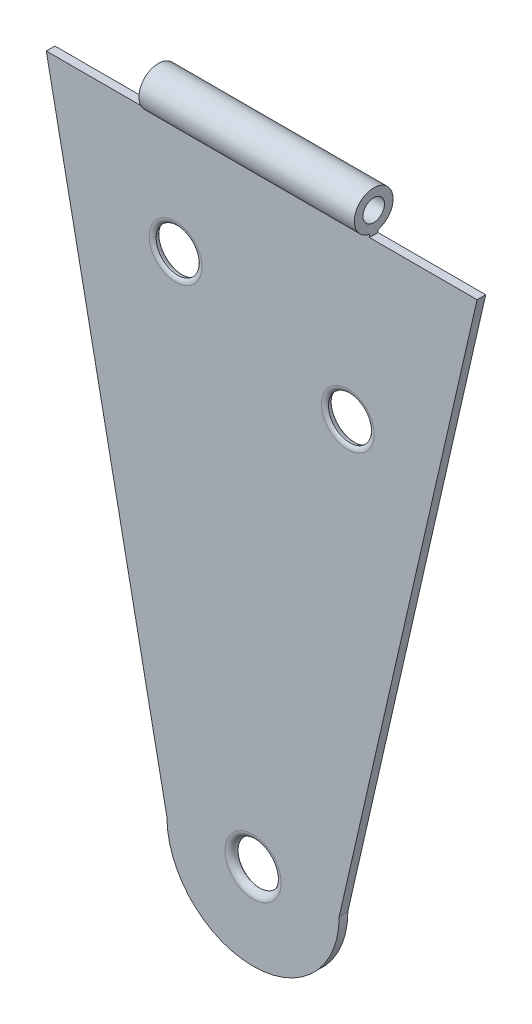
ISO-10303-21;
HEADER;
FILE_DESCRIPTION(('STEP AP214'),'2;1');
FILE_NAME('part.step','',(''),(''),'','','');
FILE_SCHEMA(('AUTOMOTIVE_DESIGN { 1 0 10303 214 1 1 1 1 }'));
ENDSEC;
DATA;
#1=APPLICATION_CONTEXT('core data for automotive mechanical design processes');
#2=APPLICATION_PROTOCOL_DEFINITION('international standard','automotive_design',2000,#1);
#3=PRODUCT_CONTEXT('',#1,'mechanical');
#4=PRODUCT('Part','Part','',(#3));
#5=PRODUCT_RELATED_PRODUCT_CATEGORY('part','',(#4));
#6=PRODUCT_DEFINITION_FORMATION('','',#4);
#7=PRODUCT_DEFINITION_CONTEXT('part definition',#1,'design');
#8=PRODUCT_DEFINITION('design','',#6,#7);
#9=PRODUCT_DEFINITION_SHAPE('','',#8);
#10=(LENGTH_UNIT() NAMED_UNIT(*) SI_UNIT(.MILLI.,.METRE.));
#11=(NAMED_UNIT(*) PLANE_ANGLE_UNIT() SI_UNIT($,.RADIAN.));
#12=(NAMED_UNIT(*) SI_UNIT($,.STERADIAN.) SOLID_ANGLE_UNIT());
#13=UNCERTAINTY_MEASURE_WITH_UNIT(LENGTH_MEASURE(1.E-05),#10,'distance_accuracy_value','');
#14=(GEOMETRIC_REPRESENTATION_CONTEXT(3) GLOBAL_UNCERTAINTY_ASSIGNED_CONTEXT((#13)) GLOBAL_UNIT_ASSIGNED_CONTEXT((#10,
#11,#12)) REPRESENTATION_CONTEXT('',''));
#15=CARTESIAN_POINT('',(0.,0.,0.));
#16=DIRECTION('',(0.,0.,1.));
#17=DIRECTION('',(1.,0.,0.));
#18=AXIS2_PLACEMENT_3D('',#15,#16,#17);
#19=CARTESIAN_POINT('',(0.,0.,0.2));
#20=DIRECTION('',(0.,0.,1.));
#21=DIRECTION('',(1.,0.,0.));
#22=AXIS2_PLACEMENT_3D('',#19,#20,#21);
#23=PLANE('',#22);
#24=CARTESIAN_POINT('',(-12.8478076350027,4.28327146141783,0.2));
#25=DIRECTION('',(0.,0.,1.));
#26=DIRECTION('',(1.,0.,0.));
#27=AXIS2_PLACEMENT_3D('',#24,#25,#26);
#28=CIRCLE('',#27,0.61180339887499);
#29=CARTESIAN_POINT('',(-12.2360042361277,4.28327146141783,0.2));
#30=VERTEX_POINT('',#29);
#31=EDGE_CURVE('E125',#30,#30,#28,.F.);
#32=ORIENTED_EDGE('',*,*,#31,.T.);
#33=EDGE_LOOP('',(#32));
#34=FACE_BOUND('',#33,.T.);
#35=CARTESIAN_POINT('',(-16.8478076350027,5.65262828523672,0.2));
#36=DIRECTION('',(0.,0.,1.));
#37=DIRECTION('',(1.,0.,0.));
#38=AXIS2_PLACEMENT_3D('',#35,#36,#37);
#39=CIRCLE('',#38,0.611803398874989);
#40=CARTESIAN_POINT('',(-16.2360042361277,5.65262828523672,0.2));
#41=VERTEX_POINT('',#40);
#42=EDGE_CURVE('E128',#41,#41,#39,.F.);
#43=ORIENTED_EDGE('',*,*,#42,.T.);
#44=EDGE_LOOP('',(#43));
#45=FACE_BOUND('',#44,.T.);
#46=CARTESIAN_POINT('',(-15.0478076350027,-5.8135010167839,0.2));
#47=DIRECTION('',(0.,0.,1.));
#48=DIRECTION('',(1.,0.,0.));
#49=AXIS2_PLACEMENT_3D('',#46,#47,#48);
#50=CIRCLE('',#49,0.650000000000001);
#51=CARTESIAN_POINT('',(-14.3978076350027,-5.8135010167839,0.2));
#52=VERTEX_POINT('',#51);
#53=EDGE_CURVE('E146',#52,#52,#50,.F.);
#54=ORIENTED_EDGE('',*,*,#53,.T.);
#55=EDGE_LOOP('',(#54));
#56=FACE_BOUND('',#55,.T.);
#57=DIRECTION('',(0.222824801502141,0.974858506571867,0.));
#58=VECTOR('',#57,1.);
#59=CARTESIAN_POINT('',(-11.1371482297741,2.54563388109122,0.2));
#60=LINE('',#59,#58);
#61=CARTESIAN_POINT('',(-13.0478076350027,-5.8135010167839,0.2));
#62=VERTEX_POINT('',#61);
#63=CARTESIAN_POINT('',(-9.8478076350027,8.1864989832161,0.200000000000001));
#64=VERTEX_POINT('',#63);
#65=EDGE_CURVE('E162',#62,#64,#60,.T.);
#66=ORIENTED_EDGE('',*,*,#65,.T.);
#67=DIRECTION('',(-1.,0.,0.));
#68=VECTOR('',#67,1.);
#69=CARTESIAN_POINT('',(0.,8.1864989832161,0.2));
#70=LINE('',#69,#68);
#71=CARTESIAN_POINT('',(-12.3478076350027,8.1864989832161,0.200000000000001));
#72=VERTEX_POINT('',#71);
#73=EDGE_CURVE('E179',#64,#72,#70,.T.);
#74=ORIENTED_EDGE('',*,*,#73,.T.);
#75=DIRECTION('',(0.,1.,0.));
#76=VECTOR('',#75,1.);
#77=CARTESIAN_POINT('',(-12.3478076350027,0.,0.2));
#78=LINE('',#77,#76);
#79=CARTESIAN_POINT('',(-12.3478076350027,8.24775076384649,0.2));
#80=VERTEX_POINT('',#79);
#81=EDGE_CURVE('E188',#72,#80,#78,.T.);
#82=ORIENTED_EDGE('',*,*,#81,.T.);
#83=DIRECTION('',(1.,0.,0.));
#84=VECTOR('',#83,1.);
#85=CARTESIAN_POINT('',(-19.8478076350027,8.24775076384649,0.2));
#86=LINE('',#85,#84);
#87=CARTESIAN_POINT('',(-17.3478076350027,8.24775076384649,0.2));
#88=VERTEX_POINT('',#87);
#89=EDGE_CURVE('E170',#88,#80,#86,.T.);
#90=ORIENTED_EDGE('',*,*,#89,.F.);
#91=DIRECTION('',(0.,-1.,0.));
#92=VECTOR('',#91,1.);
#93=CARTESIAN_POINT('',(-17.3478076350027,0.,0.2));
#94=LINE('',#93,#92);
#95=CARTESIAN_POINT('',(-17.3478076350027,8.1864989832161,0.200000000000001));
#96=VERTEX_POINT('',#95);
#97=EDGE_CURVE('E49',#88,#96,#94,.T.);
#98=ORIENTED_EDGE('',*,*,#97,.T.);
#99=DIRECTION('',(-1.,0.,0.));
#100=VECTOR('',#99,1.);
#101=CARTESIAN_POINT('',(0.,8.1864989832161,0.2));
#102=LINE('',#101,#100);
#103=CARTESIAN_POINT('',(-19.8478076350027,8.1864989832161,0.200000000000001));
#104=VERTEX_POINT('',#103);
#105=EDGE_CURVE('E114',#96,#104,#102,.T.);
#106=ORIENTED_EDGE('',*,*,#105,.T.);
#107=DIRECTION('',(0.196116135138184,-0.98058067569092,0.));
#108=VECTOR('',#107,1.);
#109=CARTESIAN_POINT('',(-17.5101036907303,-3.50202073814605,0.2));
#110=LINE('',#109,#108);
#111=CARTESIAN_POINT('',(-17.0478076350027,-5.8135010167839,0.2));
#112=VERTEX_POINT('',#111);
#113=EDGE_CURVE('E166',#104,#112,#110,.T.);
#114=ORIENTED_EDGE('',*,*,#113,.T.);
#115=CARTESIAN_POINT('',(-15.0478076350027,-5.8135010167839,0.2));
#116=DIRECTION('',(0.,0.,1.));
#117=DIRECTION('',(1.,0.,0.));
#118=AXIS2_PLACEMENT_3D('',#115,#116,#117);
#119=CIRCLE('',#118,2.);
#120=EDGE_CURVE('E173',#112,#62,#119,.T.);
#121=ORIENTED_EDGE('',*,*,#120,.T.);
#122=EDGE_LOOP('',(#66,#74,#82,#90,#98,#106,#114,#121));
#123=FACE_BOUND('',#122,.T.);
#124=ADVANCED_FACE('F34',(#34,#45,#56,#123),#23,.T.);
#125=CARTESIAN_POINT('',(0.,0.,0.));
#126=DIRECTION('',(0.,0.,1.));
#127=DIRECTION('',(1.,0.,0.));
#128=AXIS2_PLACEMENT_3D('',#125,#126,#127);
#129=PLANE('',#128);
#130=CARTESIAN_POINT('',(-15.0478076350027,-5.8135010167839,0.));
#131=DIRECTION('',(0.,0.,1.));
#132=DIRECTION('',(1.,0.,0.));
#133=AXIS2_PLACEMENT_3D('',#130,#131,#132);
#134=CIRCLE('',#133,0.61180339887499);
#135=CARTESIAN_POINT('',(-14.4360042361277,-5.8135010167839,0.));
#136=VERTEX_POINT('',#135);
#137=EDGE_CURVE('E131',#136,#136,#134,.T.);
#138=ORIENTED_EDGE('',*,*,#137,.T.);
#139=EDGE_LOOP('',(#138));
#140=FACE_BOUND('',#139,.T.);
#141=CARTESIAN_POINT('',(-16.8478076350027,5.65262828523672,0.));
#142=DIRECTION('',(0.,0.,1.));
#143=DIRECTION('',(1.,0.,0.));
#144=AXIS2_PLACEMENT_3D('',#141,#142,#143);
#145=CIRCLE('',#144,0.649999999999999);
#146=CARTESIAN_POINT('',(-16.1978076350027,5.65262828523672,0.));
#147=VERTEX_POINT('',#146);
#148=EDGE_CURVE('E140',#147,#147,#145,.T.);
#149=ORIENTED_EDGE('',*,*,#148,.T.);
#150=EDGE_LOOP('',(#149));
#151=FACE_BOUND('',#150,.T.);
#152=CARTESIAN_POINT('',(-12.8478076350027,4.28327146141783,0.));
#153=DIRECTION('',(0.,0.,1.));
#154=DIRECTION('',(1.,0.,0.));
#155=AXIS2_PLACEMENT_3D('',#152,#153,#154);
#156=CIRCLE('',#155,0.650000000000001);
#157=CARTESIAN_POINT('',(-12.1978076350027,4.28327146141783,0.));
#158=VERTEX_POINT('',#157);
#159=EDGE_CURVE('E143',#158,#158,#156,.T.);
#160=ORIENTED_EDGE('',*,*,#159,.T.);
#161=EDGE_LOOP('',(#160));
#162=FACE_BOUND('',#161,.T.);
#163=DIRECTION('',(-1.,0.,0.));
#164=VECTOR('',#163,1.);
#165=CARTESIAN_POINT('',(0.,8.1864989832161,0.));
#166=LINE('',#165,#164);
#167=CARTESIAN_POINT('',(-9.8478076350027,8.1864989832161,0.));
#168=VERTEX_POINT('',#167);
#169=CARTESIAN_POINT('',(-12.3478076350027,8.1864989832161,0.));
#170=VERTEX_POINT('',#169);
#171=EDGE_CURVE('E11',#168,#170,#166,.T.);
#172=ORIENTED_EDGE('',*,*,#171,.F.);
#173=DIRECTION('',(0.222824801502141,0.974858506571867,0.));
#174=VECTOR('',#173,1.);
#175=CARTESIAN_POINT('',(-11.1371482297741,2.54563388109122,0.));
#176=LINE('',#175,#174);
#177=CARTESIAN_POINT('',(-13.0478076350027,-5.8135010167839,0.));
#178=VERTEX_POINT('',#177);
#179=EDGE_CURVE('E163',#178,#168,#176,.T.);
#180=ORIENTED_EDGE('',*,*,#179,.F.);
#181=CARTESIAN_POINT('',(-15.0478076350027,-5.8135010167839,0.));
#182=DIRECTION('',(0.,0.,1.));
#183=DIRECTION('',(1.,0.,0.));
#184=AXIS2_PLACEMENT_3D('',#181,#182,#183);
#185=CIRCLE('',#184,2.);
#186=CARTESIAN_POINT('',(-17.0478076350027,-5.8135010167839,0.));
#187=VERTEX_POINT('',#186);
#188=EDGE_CURVE('E167',#187,#178,#185,.T.);
#189=ORIENTED_EDGE('',*,*,#188,.F.);
#190=DIRECTION('',(0.196116135138184,-0.98058067569092,0.));
#191=VECTOR('',#190,1.);
#192=CARTESIAN_POINT('',(-17.5101036907303,-3.50202073814605,0.));
#193=LINE('',#192,#191);
#194=CARTESIAN_POINT('',(-19.8478076350027,8.1864989832161,0.));
#195=VERTEX_POINT('',#194);
#196=EDGE_CURVE('E120',#195,#187,#193,.T.);
#197=ORIENTED_EDGE('',*,*,#196,.F.);
#198=DIRECTION('',(-1.,0.,0.));
#199=VECTOR('',#198,1.);
#200=CARTESIAN_POINT('',(0.,8.1864989832161,0.));
#201=LINE('',#200,#199);
#202=CARTESIAN_POINT('',(-17.3478076350027,8.1864989832161,0.));
#203=VERTEX_POINT('',#202);
#204=EDGE_CURVE('E42',#203,#195,#201,.T.);
#205=ORIENTED_EDGE('',*,*,#204,.F.);
#206=DIRECTION('',(0.,-1.,0.));
#207=VECTOR('',#206,1.);
#208=CARTESIAN_POINT('',(-17.3478076350027,0.,0.));
#209=LINE('',#208,#207);
#210=CARTESIAN_POINT('',(-17.3478076350027,8.24775076384649,0.));
#211=VERTEX_POINT('',#210);
#212=EDGE_CURVE('E98',#211,#203,#209,.T.);
#213=ORIENTED_EDGE('',*,*,#212,.F.);
#214=DIRECTION('',(1.,0.,0.));
#215=VECTOR('',#214,1.);
#216=CARTESIAN_POINT('',(-19.8478076350027,8.24775076384649,0.));
#217=LINE('',#216,#215);
#218=CARTESIAN_POINT('',(-12.3478076350027,8.24775076384649,0.));
#219=VERTEX_POINT('',#218);
#220=EDGE_CURVE('E177',#211,#219,#217,.T.);
#221=ORIENTED_EDGE('',*,*,#220,.T.);
#222=DIRECTION('',(0.,1.,0.));
#223=VECTOR('',#222,1.);
#224=CARTESIAN_POINT('',(-12.3478076350027,0.,0.));
#225=LINE('',#224,#223);
#226=EDGE_CURVE('E57',#170,#219,#225,.T.);
#227=ORIENTED_EDGE('',*,*,#226,.F.);
#228=EDGE_LOOP('',(#172,#180,#189,#197,#205,#213,#221,#227));
#229=FACE_BOUND('',#228,.T.);
#230=ADVANCED_FACE('F118',(#140,#151,#162,#229),#129,.F.);
#231=CARTESIAN_POINT('',(-19.8478076350027,8.6864989832161,0.1));
#232=DIRECTION('',(1.,0.,0.));
#233=DIRECTION('',(0.,0.,-1.));
#234=AXIS2_PLACEMENT_3D('',#231,#232,#233);
#235=CYLINDRICAL_SURFACE('',#234,0.45);
#236=ORIENTED_EDGE('',*,*,#89,.T.);
#237=CARTESIAN_POINT('',(-12.3478076350027,8.6864989832161,0.1));
#238=DIRECTION('',(1.,0.,0.));
#239=DIRECTION('',(0.,0.,-1.));
#240=AXIS2_PLACEMENT_3D('',#237,#238,#239);
#241=CIRCLE('',#240,0.45);
#242=EDGE_CURVE('E121',#80,#219,#241,.F.);
#243=ORIENTED_EDGE('',*,*,#242,.T.);
#244=ORIENTED_EDGE('',*,*,#220,.F.);
#245=CARTESIAN_POINT('',(-17.3478076350027,8.6864989832161,0.1));
#246=DIRECTION('',(-1.,0.,0.));
#247=DIRECTION('',(0.,0.,1.));
#248=AXIS2_PLACEMENT_3D('',#245,#246,#247);
#249=CIRCLE('',#248,0.45);
#250=EDGE_CURVE('E103',#211,#88,#249,.F.);
#251=ORIENTED_EDGE('',*,*,#250,.T.);
#252=EDGE_LOOP('',(#236,#243,#244,#251));
#253=FACE_BOUND('',#252,.T.);
#254=ADVANCED_FACE('F208',(#253),#235,.T.);
#255=CARTESIAN_POINT('',(-17.5101036907303,-3.50202073814605,0.2));
#256=DIRECTION('',(0.98058067569092,0.196116135138184,0.));
#257=DIRECTION('',(-0.196116135138184,0.98058067569092,0.));
#258=AXIS2_PLACEMENT_3D('',#255,#256,#257);
#259=PLANE('',#258);
#260=ORIENTED_EDGE('',*,*,#196,.T.);
#261=DIRECTION('',(0.,0.,-1.));
#262=VECTOR('',#261,1.);
#263=CARTESIAN_POINT('',(-17.0478076350027,-5.8135010167839,0.2));
#264=LINE('',#263,#262);
#265=EDGE_CURVE('E152',#112,#187,#264,.T.);
#266=ORIENTED_EDGE('',*,*,#265,.F.);
#267=ORIENTED_EDGE('',*,*,#113,.F.);
#268=DIRECTION('',(0.,0.,-1.));
#269=VECTOR('',#268,1.);
#270=CARTESIAN_POINT('',(-19.8478076350027,8.1864989832161,0.2));
#271=LINE('',#270,#269);
#272=EDGE_CURVE('E160',#104,#195,#271,.T.);
#273=ORIENTED_EDGE('',*,*,#272,.T.);
#274=EDGE_LOOP('',(#260,#266,#267,#273));
#275=FACE_BOUND('',#274,.T.);
#276=ADVANCED_FACE('F240',(#275),#259,.F.);
#277=CARTESIAN_POINT('',(-15.0478076350027,-5.8135010167839,0.2));
#278=DIRECTION('',(0.,0.,-1.));
#279=DIRECTION('',(-1.,0.,0.));
#280=AXIS2_PLACEMENT_3D('',#277,#278,#279);
#281=CYLINDRICAL_SURFACE('',#280,2.);
#282=ORIENTED_EDGE('',*,*,#188,.T.);
#283=DIRECTION('',(0.,0.,-1.));
#284=VECTOR('',#283,1.);
#285=CARTESIAN_POINT('',(-13.0478076350027,-5.8135010167839,0.2));
#286=LINE('',#285,#284);
#287=EDGE_CURVE('E155',#62,#178,#286,.T.);
#288=ORIENTED_EDGE('',*,*,#287,.F.);
#289=ORIENTED_EDGE('',*,*,#120,.F.);
#290=ORIENTED_EDGE('',*,*,#265,.T.);
#291=EDGE_LOOP('',(#282,#288,#289,#290));
#292=FACE_BOUND('',#291,.T.);
#293=ADVANCED_FACE('F237',(#292),#281,.T.);
#294=CARTESIAN_POINT('',(-11.1371482297741,2.54563388109122,0.2));
#295=DIRECTION('',(-0.974858506571867,0.222824801502141,0.));
#296=DIRECTION('',(-0.222824801502141,-0.974858506571867,0.));
#297=AXIS2_PLACEMENT_3D('',#294,#295,#296);
#298=PLANE('',#297);
#299=ORIENTED_EDGE('',*,*,#179,.T.);
#300=DIRECTION('',(0.,0.,-1.));
#301=VECTOR('',#300,1.);
#302=CARTESIAN_POINT('',(-9.8478076350027,8.1864989832161,0.2));
#303=LINE('',#302,#301);
#304=EDGE_CURVE('E158',#64,#168,#303,.T.);
#305=ORIENTED_EDGE('',*,*,#304,.F.);
#306=ORIENTED_EDGE('',*,*,#65,.F.);
#307=ORIENTED_EDGE('',*,*,#287,.T.);
#308=EDGE_LOOP('',(#299,#305,#306,#307));
#309=FACE_BOUND('',#308,.T.);
#310=ADVANCED_FACE('F205',(#309),#298,.F.);
#311=CARTESIAN_POINT('',(-15.0478076350027,-5.8135010167839,0.05));
#312=DIRECTION('',(0.,0.,1.));
#313=DIRECTION('',(1.,0.,0.));
#314=AXIS2_PLACEMENT_3D('',#311,#312,#313);
#315=TOROIDAL_SURFACE('',#314,0.650000000000001,0.15);
#316=ORIENTED_EDGE('',*,*,#53,.F.);
#317=EDGE_LOOP('',(#316));
#318=FACE_BOUND('',#317,.T.);
#319=CARTESIAN_POINT('',(-15.0478076350027,-5.8135010167839,0.05));
#320=DIRECTION('',(0.,0.,1.));
#321=DIRECTION('',(1.,0.,0.));
#322=AXIS2_PLACEMENT_3D('',#319,#320,#321);
#323=CIRCLE('',#322,0.500000000000001);
#324=CARTESIAN_POINT('',(-14.5478076350027,-5.8135010167839,0.05));
#325=VERTEX_POINT('',#324);
#326=EDGE_CURVE('E149',#325,#325,#323,.T.);
#327=ORIENTED_EDGE('',*,*,#326,.F.);
#328=EDGE_LOOP('',(#327));
#329=FACE_BOUND('',#328,.T.);
#330=ADVANCED_FACE('F236',(#318,#329),#315,.T.);
#331=CARTESIAN_POINT('',(-16.8478076350027,5.65262828523672,0.15));
#332=DIRECTION('',(0.,0.,1.));
#333=DIRECTION('',(1.,0.,0.));
#334=AXIS2_PLACEMENT_3D('',#331,#332,#333);
#335=TOROIDAL_SURFACE('',#334,0.649999999999999,0.15);
#336=CARTESIAN_POINT('',(-16.8478076350027,5.65262828523672,0.15));
#337=DIRECTION('',(0.,0.,1.));
#338=DIRECTION('',(1.,0.,0.));
#339=AXIS2_PLACEMENT_3D('',#336,#337,#338);
#340=CIRCLE('',#339,0.499999999999999);
#341=CARTESIAN_POINT('',(-16.3478076350027,5.65262828523672,0.15));
#342=VERTEX_POINT('',#341);
#343=EDGE_CURVE('E137',#342,#342,#340,.F.);
#344=ORIENTED_EDGE('',*,*,#343,.F.);
#345=EDGE_LOOP('',(#344));
#346=FACE_BOUND('',#345,.T.);
#347=ORIENTED_EDGE('',*,*,#148,.F.);
#348=EDGE_LOOP('',(#347));
#349=FACE_BOUND('',#348,.T.);
#350=ADVANCED_FACE('F247',(#346,#349),#335,.T.);
#351=CARTESIAN_POINT('',(-12.8478076350027,4.28327146141783,0.15));
#352=DIRECTION('',(0.,0.,1.));
#353=DIRECTION('',(1.,0.,0.));
#354=AXIS2_PLACEMENT_3D('',#351,#352,#353);
#355=TOROIDAL_SURFACE('',#354,0.650000000000001,0.15);
#356=CARTESIAN_POINT('',(-12.8478076350027,4.28327146141783,0.15));
#357=DIRECTION('',(0.,0.,1.));
#358=DIRECTION('',(1.,0.,0.));
#359=AXIS2_PLACEMENT_3D('',#356,#357,#358);
#360=CIRCLE('',#359,0.500000000000001);
#361=CARTESIAN_POINT('',(-12.3478076350027,4.28327146141783,0.15));
#362=VERTEX_POINT('',#361);
#363=EDGE_CURVE('E134',#362,#362,#360,.F.);
#364=ORIENTED_EDGE('',*,*,#363,.F.);
#365=EDGE_LOOP('',(#364));
#366=FACE_BOUND('',#365,.T.);
#367=ORIENTED_EDGE('',*,*,#159,.F.);
#368=EDGE_LOOP('',(#367));
#369=FACE_BOUND('',#368,.T.);
#370=ADVANCED_FACE('F251',(#366,#369),#355,.T.);
#371=CARTESIAN_POINT('',(-15.0478076350027,-5.8135010167839,0.15));
#372=DIRECTION('',(0.,0.,1.));
#373=DIRECTION('',(1.,0.,0.));
#374=AXIS2_PLACEMENT_3D('',#371,#372,#373);
#375=TOROIDAL_SURFACE('',#374,0.61180339887499,0.15);
#376=ORIENTED_EDGE('',*,*,#326,.T.);
#377=EDGE_LOOP('',(#376));
#378=FACE_BOUND('',#377,.T.);
#379=ORIENTED_EDGE('',*,*,#137,.F.);
#380=EDGE_LOOP('',(#379));
#381=FACE_BOUND('',#380,.T.);
#382=ADVANCED_FACE('F255',(#378,#381),#375,.T.);
#383=CARTESIAN_POINT('',(-12.8478076350027,4.28327146141783,0.05));
#384=DIRECTION('',(0.,0.,1.));
#385=DIRECTION('',(1.,0.,0.));
#386=AXIS2_PLACEMENT_3D('',#383,#384,#385);
#387=TOROIDAL_SURFACE('',#386,0.61180339887499,0.15);
#388=ORIENTED_EDGE('',*,*,#31,.F.);
#389=EDGE_LOOP('',(#388));
#390=FACE_BOUND('',#389,.T.);
#391=ORIENTED_EDGE('',*,*,#363,.T.);
#392=EDGE_LOOP('',(#391));
#393=FACE_BOUND('',#392,.T.);
#394=ADVANCED_FACE('F258',(#390,#393),#387,.T.);
#395=CARTESIAN_POINT('',(-16.8478076350027,5.65262828523672,0.05));
#396=DIRECTION('',(0.,0.,1.));
#397=DIRECTION('',(1.,0.,0.));
#398=AXIS2_PLACEMENT_3D('',#395,#396,#397);
#399=TOROIDAL_SURFACE('',#398,0.611803398874989,0.15);
#400=ORIENTED_EDGE('',*,*,#42,.F.);
#401=EDGE_LOOP('',(#400));
#402=FACE_BOUND('',#401,.T.);
#403=ORIENTED_EDGE('',*,*,#343,.T.);
#404=EDGE_LOOP('',(#403));
#405=FACE_BOUND('',#404,.T.);
#406=ADVANCED_FACE('F36',(#402,#405),#399,.T.);
#407=CARTESIAN_POINT('',(-19.8478076350027,8.1864989832161,-10.));
#408=DIRECTION('',(0.,1.,0.));
#409=DIRECTION('',(0.,0.,1.));
#410=AXIS2_PLACEMENT_3D('',#407,#408,#409);
#411=PLANE('',#410);
#412=DIRECTION('',(0.,0.,1.));
#413=VECTOR('',#412,1.);
#414=CARTESIAN_POINT('',(-17.3478076350027,8.1864989832161,-10.));
#415=LINE('',#414,#413);
#416=EDGE_CURVE('E102',#203,#96,#415,.T.);
#417=ORIENTED_EDGE('',*,*,#416,.F.);
#418=ORIENTED_EDGE('',*,*,#204,.T.);
#419=ORIENTED_EDGE('',*,*,#272,.F.);
#420=ORIENTED_EDGE('',*,*,#105,.F.);
#421=EDGE_LOOP('',(#417,#418,#419,#420));
#422=FACE_BOUND('',#421,.T.);
#423=ADVANCED_FACE('F111',(#422),#411,.T.);
#424=CARTESIAN_POINT('',(-17.3478076350027,8.1864989832161,-10.));
#425=DIRECTION('',(-1.,0.,0.));
#426=DIRECTION('',(0.,0.,1.));
#427=AXIS2_PLACEMENT_3D('',#424,#425,#426);
#428=PLANE('',#427);
#429=ORIENTED_EDGE('',*,*,#250,.F.);
#430=ORIENTED_EDGE('',*,*,#212,.T.);
#431=ORIENTED_EDGE('',*,*,#416,.T.);
#432=ORIENTED_EDGE('',*,*,#97,.F.);
#433=EDGE_LOOP('',(#429,#430,#431,#432));
#434=FACE_BOUND('',#433,.T.);
#435=CARTESIAN_POINT('',(-17.3478076350027,8.6864989832161,0.1));
#436=DIRECTION('',(-1.,0.,0.));
#437=DIRECTION('',(0.,0.,1.));
#438=AXIS2_PLACEMENT_3D('',#435,#436,#437);
#439=CIRCLE('',#438,0.25);
#440=CARTESIAN_POINT('',(-17.3478076350027,8.6864989832161,0.35));
#441=VERTEX_POINT('',#440);
#442=EDGE_CURVE('E192',#441,#441,#439,.F.);
#443=ORIENTED_EDGE('',*,*,#442,.T.);
#444=EDGE_LOOP('',(#443));
#445=FACE_BOUND('',#444,.T.);
#446=ADVANCED_FACE('F100',(#434,#445),#428,.T.);
#447=CARTESIAN_POINT('',(-9.8478076350027,8.1864989832161,-10.));
#448=DIRECTION('',(0.,1.,0.));
#449=DIRECTION('',(0.,0.,1.));
#450=AXIS2_PLACEMENT_3D('',#447,#448,#449);
#451=PLANE('',#450);
#452=ORIENTED_EDGE('',*,*,#304,.T.);
#453=ORIENTED_EDGE('',*,*,#171,.T.);
#454=DIRECTION('',(0.,0.,1.));
#455=VECTOR('',#454,1.);
#456=CARTESIAN_POINT('',(-12.3478076350027,8.1864989832161,-10.));
#457=LINE('',#456,#455);
#458=EDGE_CURVE('E108',#170,#72,#457,.T.);
#459=ORIENTED_EDGE('',*,*,#458,.T.);
#460=ORIENTED_EDGE('',*,*,#73,.F.);
#461=EDGE_LOOP('',(#452,#453,#459,#460));
#462=FACE_BOUND('',#461,.T.);
#463=ADVANCED_FACE('F198',(#462),#451,.T.);
#464=CARTESIAN_POINT('',(-12.3478076350027,8.1864989832161,-10.));
#465=DIRECTION('',(1.,0.,0.));
#466=DIRECTION('',(0.,0.,-1.));
#467=AXIS2_PLACEMENT_3D('',#464,#465,#466);
#468=PLANE('',#467);
#469=ORIENTED_EDGE('',*,*,#458,.F.);
#470=ORIENTED_EDGE('',*,*,#226,.T.);
#471=ORIENTED_EDGE('',*,*,#242,.F.);
#472=ORIENTED_EDGE('',*,*,#81,.F.);
#473=EDGE_LOOP('',(#469,#470,#471,#472));
#474=FACE_BOUND('',#473,.T.);
#475=CARTESIAN_POINT('',(-12.3478076350027,8.6864989832161,0.1));
#476=DIRECTION('',(1.,0.,0.));
#477=DIRECTION('',(0.,0.,-1.));
#478=AXIS2_PLACEMENT_3D('',#475,#476,#477);
#479=CIRCLE('',#478,0.25);
#480=CARTESIAN_POINT('',(-12.3478076350027,8.6864989832161,-0.15));
#481=VERTEX_POINT('',#480);
#482=EDGE_CURVE('E185',#481,#481,#479,.F.);
#483=ORIENTED_EDGE('',*,*,#482,.T.);
#484=EDGE_LOOP('',(#483));
#485=FACE_BOUND('',#484,.T.);
#486=ADVANCED_FACE('F209',(#474,#485),#468,.T.);
#487=CARTESIAN_POINT('',(-19.8478076350027,8.6864989832161,0.1));
#488=DIRECTION('',(1.,0.,0.));
#489=DIRECTION('',(0.,0.,-1.));
#490=AXIS2_PLACEMENT_3D('',#487,#488,#489);
#491=CYLINDRICAL_SURFACE('',#490,0.25);
#492=ORIENTED_EDGE('',*,*,#442,.F.);
#493=EDGE_LOOP('',(#492));
#494=FACE_BOUND('',#493,.T.);
#495=ORIENTED_EDGE('',*,*,#482,.F.);
#496=EDGE_LOOP('',(#495));
#497=FACE_BOUND('',#496,.T.);
#498=ADVANCED_FACE('F212',(#494,#497),#491,.F.);
#499=CLOSED_SHELL('',(#124,#230,#254,#276,#293,#310,#330,#350,#370,#382,#394,#406,#423,#446,
#463,#486,#498));
#500=MANIFOLD_SOLID_BREP('B2',#499);
#501=ADVANCED_BREP_SHAPE_REPRESENTATION('',(#18,#500),#14);
#502=SHAPE_DEFINITION_REPRESENTATION(#9,#501);
ENDSEC;
END-ISO-10303-21;
